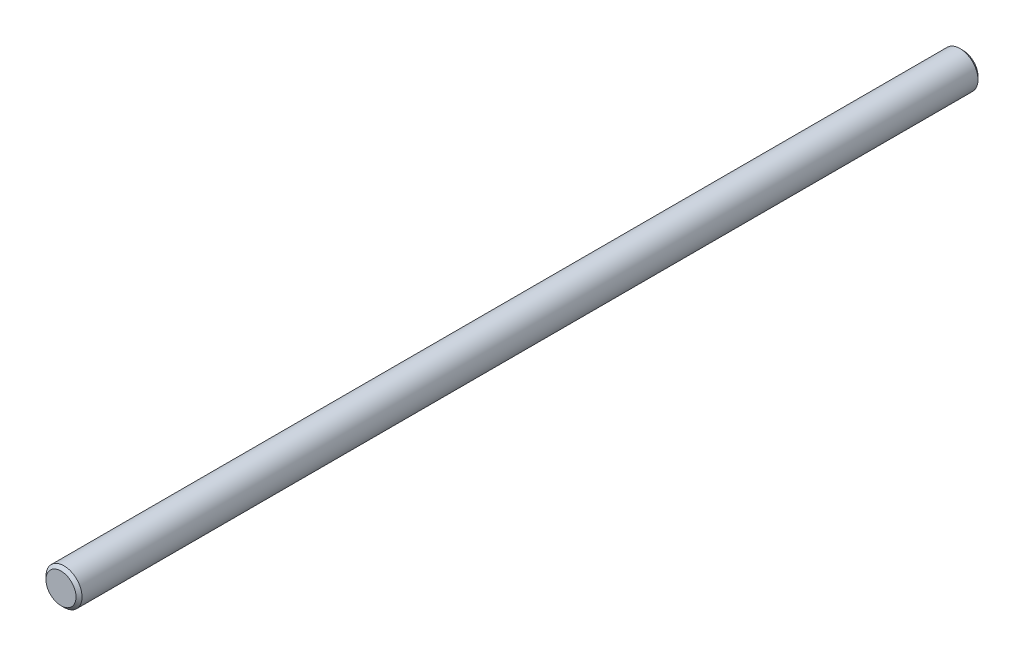
ISO-10303-21;
HEADER;
FILE_DESCRIPTION(('STEP AP214'),'2;1');
FILE_NAME('part.step','',(''),(''),'','','');
FILE_SCHEMA(('AUTOMOTIVE_DESIGN { 1 0 10303 214 1 1 1 1 }'));
ENDSEC;
DATA;
#1=APPLICATION_CONTEXT('core data for automotive mechanical design processes');
#2=APPLICATION_PROTOCOL_DEFINITION('international standard','automotive_design',2000,#1);
#3=PRODUCT_CONTEXT('',#1,'mechanical');
#4=PRODUCT('Part','Part','',(#3));
#5=PRODUCT_RELATED_PRODUCT_CATEGORY('part','',(#4));
#6=PRODUCT_DEFINITION_FORMATION('','',#4);
#7=PRODUCT_DEFINITION_CONTEXT('part definition',#1,'design');
#8=PRODUCT_DEFINITION('design','',#6,#7);
#9=PRODUCT_DEFINITION_SHAPE('','',#8);
#10=(LENGTH_UNIT() NAMED_UNIT(*) SI_UNIT(.MILLI.,.METRE.));
#11=(NAMED_UNIT(*) PLANE_ANGLE_UNIT() SI_UNIT($,.RADIAN.));
#12=(NAMED_UNIT(*) SI_UNIT($,.STERADIAN.) SOLID_ANGLE_UNIT());
#13=UNCERTAINTY_MEASURE_WITH_UNIT(LENGTH_MEASURE(1.E-05),#10,'distance_accuracy_value','');
#14=(GEOMETRIC_REPRESENTATION_CONTEXT(3) GLOBAL_UNCERTAINTY_ASSIGNED_CONTEXT((#13)) GLOBAL_UNIT_ASSIGNED_CONTEXT((#10,
#11,#12)) REPRESENTATION_CONTEXT('',''));
#15=CARTESIAN_POINT('',(0.,0.,0.));
#16=DIRECTION('',(0.,0.,1.));
#17=DIRECTION('',(1.,0.,0.));
#18=AXIS2_PLACEMENT_3D('',#15,#16,#17);
#19=CARTESIAN_POINT('',(0.,0.,300.));
#20=DIRECTION('',(0.,0.,-1.));
#21=DIRECTION('',(-1.,0.,0.));
#22=AXIS2_PLACEMENT_3D('',#19,#20,#21);
#23=CYLINDRICAL_SURFACE('',#22,6.);
#24=CARTESIAN_POINT('',(0.,0.,1.00000000000006));
#25=DIRECTION('',(0.,0.,1.));
#26=DIRECTION('',(1.,0.,0.));
#27=AXIS2_PLACEMENT_3D('',#24,#25,#26);
#28=CIRCLE('',#27,6.);
#29=CARTESIAN_POINT('',(6.,0.,1.00000000000006));
#30=VERTEX_POINT('',#29);
#31=EDGE_CURVE('E42',#30,#30,#28,.T.);
#32=ORIENTED_EDGE('',*,*,#31,.T.);
#33=EDGE_LOOP('',(#32));
#34=FACE_BOUND('',#33,.T.);
#35=CARTESIAN_POINT('',(0.,0.,299.));
#36=DIRECTION('',(0.,0.,1.));
#37=DIRECTION('',(1.,0.,0.));
#38=AXIS2_PLACEMENT_3D('',#35,#36,#37);
#39=CIRCLE('',#38,6.);
#40=CARTESIAN_POINT('',(6.,0.,299.));
#41=VERTEX_POINT('',#40);
#42=EDGE_CURVE('E46',#41,#41,#39,.F.);
#43=ORIENTED_EDGE('',*,*,#42,.T.);
#44=EDGE_LOOP('',(#43));
#45=FACE_BOUND('',#44,.T.);
#46=ADVANCED_FACE('F31',(#34,#45),#23,.T.);
#47=CARTESIAN_POINT('',(0.,0.,300.));
#48=DIRECTION('',(0.,0.,1.));
#49=DIRECTION('',(1.,0.,0.));
#50=AXIS2_PLACEMENT_3D('',#47,#48,#49);
#51=PLANE('',#50);
#52=CARTESIAN_POINT('',(0.,0.,300.));
#53=DIRECTION('',(0.,0.,1.));
#54=DIRECTION('',(1.,0.,0.));
#55=AXIS2_PLACEMENT_3D('',#52,#53,#54);
#56=CIRCLE('',#55,4.99999999999998);
#57=CARTESIAN_POINT('',(4.99999999999998,0.,300.));
#58=VERTEX_POINT('',#57);
#59=EDGE_CURVE('E10',#58,#58,#56,.T.);
#60=ORIENTED_EDGE('',*,*,#59,.T.);
#61=EDGE_LOOP('',(#60));
#62=FACE_BOUND('',#61,.T.);
#63=ADVANCED_FACE('F62',(#62),#51,.T.);
#64=CARTESIAN_POINT('',(0.,0.,0.));
#65=DIRECTION('',(0.,0.,1.));
#66=DIRECTION('',(1.,0.,0.));
#67=AXIS2_PLACEMENT_3D('',#64,#65,#66);
#68=PLANE('',#67);
#69=CARTESIAN_POINT('',(0.,0.,0.));
#70=DIRECTION('',(0.,0.,1.));
#71=DIRECTION('',(1.,0.,0.));
#72=AXIS2_PLACEMENT_3D('',#69,#70,#71);
#73=CIRCLE('',#72,4.99999999999995);
#74=CARTESIAN_POINT('',(4.99999999999995,0.,0.));
#75=VERTEX_POINT('',#74);
#76=EDGE_CURVE('E38',#75,#75,#73,.F.);
#77=ORIENTED_EDGE('',*,*,#76,.T.);
#78=EDGE_LOOP('',(#77));
#79=FACE_BOUND('',#78,.T.);
#80=ADVANCED_FACE('F59',(#79),#68,.F.);
#81=CARTESIAN_POINT('',(0.,0.,1.00000000000006));
#82=DIRECTION('',(0.,0.,1.));
#83=DIRECTION('',(1.,0.,0.));
#84=AXIS2_PLACEMENT_3D('',#81,#82,#83);
#85=CONICAL_SURFACE('',#84,6.,0.785398163397445);
#86=ORIENTED_EDGE('',*,*,#76,.F.);
#87=EDGE_LOOP('',(#86));
#88=FACE_BOUND('',#87,.T.);
#89=ORIENTED_EDGE('',*,*,#31,.F.);
#90=EDGE_LOOP('',(#89));
#91=FACE_BOUND('',#90,.T.);
#92=ADVANCED_FACE('F55',(#88,#91),#85,.T.);
#93=CARTESIAN_POINT('',(0.,0.,300.));
#94=DIRECTION('',(0.,0.,-1.));
#95=DIRECTION('',(-1.,0.,0.));
#96=AXIS2_PLACEMENT_3D('',#93,#94,#95);
#97=CONICAL_SURFACE('',#96,4.99999999999998,0.785398163397431);
#98=ORIENTED_EDGE('',*,*,#42,.F.);
#99=EDGE_LOOP('',(#98));
#100=FACE_BOUND('',#99,.T.);
#101=ORIENTED_EDGE('',*,*,#59,.F.);
#102=EDGE_LOOP('',(#101));
#103=FACE_BOUND('',#102,.T.);
#104=ADVANCED_FACE('F33',(#100,#103),#97,.T.);
#105=CLOSED_SHELL('',(#46,#63,#80,#92,#104));
#106=MANIFOLD_SOLID_BREP('B2',#105);
#107=ADVANCED_BREP_SHAPE_REPRESENTATION('',(#18,#106),#14);
#108=SHAPE_DEFINITION_REPRESENTATION(#9,#107);
ENDSEC;
END-ISO-10303-21;
